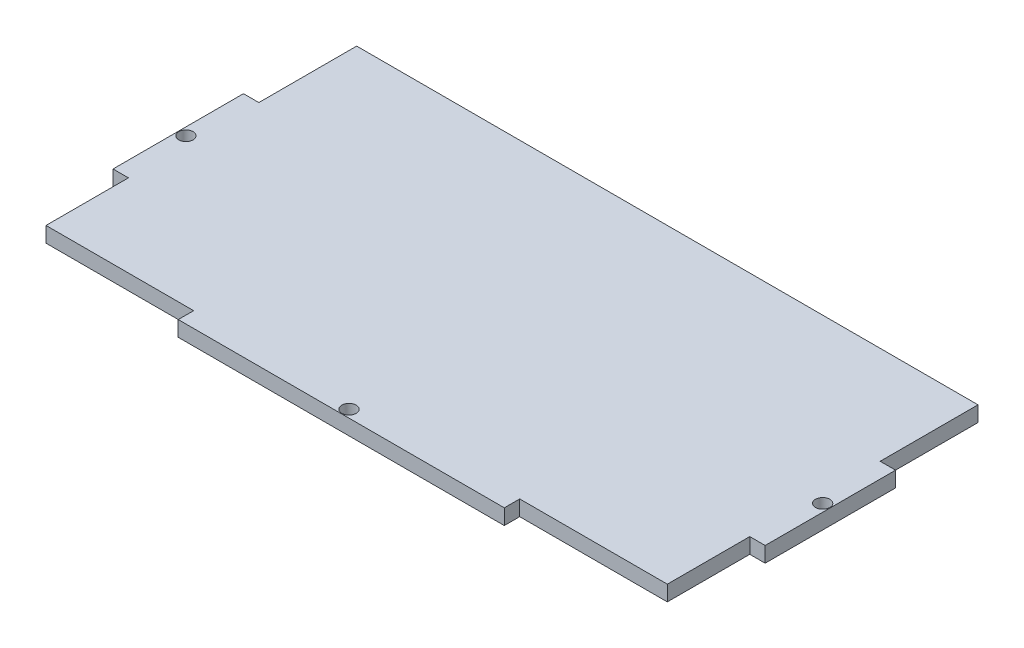
ISO-10303-21;
HEADER;
FILE_DESCRIPTION(('STEP AP214'),'2;1');
FILE_NAME('part.step','',(''),(''),'','','');
FILE_SCHEMA(('AUTOMOTIVE_DESIGN { 1 0 10303 214 1 1 1 1 }'));
ENDSEC;
DATA;
#1=APPLICATION_CONTEXT('core data for automotive mechanical design processes');
#2=APPLICATION_PROTOCOL_DEFINITION('international standard','automotive_design',2000,#1);
#3=PRODUCT_CONTEXT('',#1,'mechanical');
#4=PRODUCT('Part','Part','',(#3));
#5=PRODUCT_RELATED_PRODUCT_CATEGORY('part','',(#4));
#6=PRODUCT_DEFINITION_FORMATION('','',#4);
#7=PRODUCT_DEFINITION_CONTEXT('part definition',#1,'design');
#8=PRODUCT_DEFINITION('design','',#6,#7);
#9=PRODUCT_DEFINITION_SHAPE('','',#8);
#10=(LENGTH_UNIT() NAMED_UNIT(*) SI_UNIT(.MILLI.,.METRE.));
#11=(NAMED_UNIT(*) PLANE_ANGLE_UNIT() SI_UNIT($,.RADIAN.));
#12=(NAMED_UNIT(*) SI_UNIT($,.STERADIAN.) SOLID_ANGLE_UNIT());
#13=UNCERTAINTY_MEASURE_WITH_UNIT(LENGTH_MEASURE(1.E-05),#10,'distance_accuracy_value','');
#14=(GEOMETRIC_REPRESENTATION_CONTEXT(3) GLOBAL_UNCERTAINTY_ASSIGNED_CONTEXT((#13)) GLOBAL_UNIT_ASSIGNED_CONTEXT((#10,
#11,#12)) REPRESENTATION_CONTEXT('',''));
#15=CARTESIAN_POINT('',(0.,0.,0.));
#16=DIRECTION('',(0.,0.,1.));
#17=DIRECTION('',(1.,0.,0.));
#18=AXIS2_PLACEMENT_3D('',#15,#16,#17);
#19=CARTESIAN_POINT('',(63.5,2.9972,31.75));
#20=DIRECTION('',(-1.,0.,0.));
#21=DIRECTION('',(0.,0.,1.));
#22=AXIS2_PLACEMENT_3D('',#19,#20,#21);
#23=PLANE('',#22);
#24=DIRECTION('',(0.,0.,-1.));
#25=VECTOR('',#24,1.);
#26=CARTESIAN_POINT('',(63.5,2.9972,31.75));
#27=LINE('',#26,#25);
#28=CARTESIAN_POINT('',(63.5,2.9972,12.7));
#29=VERTEX_POINT('',#28);
#30=CARTESIAN_POINT('',(63.5,2.9972,-12.7));
#31=VERTEX_POINT('',#30);
#32=EDGE_CURVE('E184',#29,#31,#27,.T.);
#33=ORIENTED_EDGE('',*,*,#32,.F.);
#34=DIRECTION('',(0.,1.,0.));
#35=VECTOR('',#34,1.);
#36=CARTESIAN_POINT('',(63.5,-0.00100000000000013,12.7));
#37=LINE('',#36,#35);
#38=CARTESIAN_POINT('',(63.5,0.,12.7));
#39=VERTEX_POINT('',#38);
#40=EDGE_CURVE('E286',#39,#29,#37,.T.);
#41=ORIENTED_EDGE('',*,*,#40,.F.);
#42=DIRECTION('',(0.,0.,-1.));
#43=VECTOR('',#42,1.);
#44=CARTESIAN_POINT('',(63.5,0.,31.75));
#45=LINE('',#44,#43);
#46=CARTESIAN_POINT('',(63.5,0.,-12.7));
#47=VERTEX_POINT('',#46);
#48=EDGE_CURVE('E186',#39,#47,#45,.T.);
#49=ORIENTED_EDGE('',*,*,#48,.T.);
#50=DIRECTION('',(0.,1.,0.));
#51=VECTOR('',#50,1.);
#52=CARTESIAN_POINT('',(63.5,-0.00100000000000013,-12.7));
#53=LINE('',#52,#51);
#54=EDGE_CURVE('E250',#47,#31,#53,.T.);
#55=ORIENTED_EDGE('',*,*,#54,.T.);
#56=EDGE_LOOP('',(#33,#41,#49,#55));
#57=FACE_BOUND('',#56,.T.);
#58=ADVANCED_FACE('F39',(#57),#23,.F.);
#59=CARTESIAN_POINT('',(-63.5,2.9972,-31.75));
#60=DIRECTION('',(0.,0.,1.));
#61=DIRECTION('',(1.,0.,0.));
#62=AXIS2_PLACEMENT_3D('',#59,#60,#61);
#63=PLANE('',#62);
#64=DIRECTION('',(-1.,0.,0.));
#65=VECTOR('',#64,1.);
#66=CARTESIAN_POINT('',(-63.5,0.,-31.75));
#67=LINE('',#66,#65);
#68=CARTESIAN_POINT('',(60.5028,0.,-31.75));
#69=VERTEX_POINT('',#68);
#70=CARTESIAN_POINT('',(-60.5028,0.,-31.75));
#71=VERTEX_POINT('',#70);
#72=EDGE_CURVE('E180',#69,#71,#67,.T.);
#73=ORIENTED_EDGE('',*,*,#72,.T.);
#74=DIRECTION('',(0.,1.,0.));
#75=VECTOR('',#74,1.);
#76=CARTESIAN_POINT('',(-60.5028,-0.00100000000000013,-31.75));
#77=LINE('',#76,#75);
#78=CARTESIAN_POINT('',(-60.5028,2.9972,-31.75));
#79=VERTEX_POINT('',#78);
#80=EDGE_CURVE('E162',#71,#79,#77,.T.);
#81=ORIENTED_EDGE('',*,*,#80,.T.);
#82=DIRECTION('',(-1.,0.,0.));
#83=VECTOR('',#82,1.);
#84=CARTESIAN_POINT('',(-63.5,2.9972,-31.75));
#85=LINE('',#84,#83);
#86=CARTESIAN_POINT('',(60.5028,2.9972,-31.75));
#87=VERTEX_POINT('',#86);
#88=EDGE_CURVE('E195',#87,#79,#85,.T.);
#89=ORIENTED_EDGE('',*,*,#88,.F.);
#90=DIRECTION('',(0.,1.,0.));
#91=VECTOR('',#90,1.);
#92=CARTESIAN_POINT('',(60.5028,-0.00100000000000013,-31.75));
#93=LINE('',#92,#91);
#94=EDGE_CURVE('E243',#69,#87,#93,.T.);
#95=ORIENTED_EDGE('',*,*,#94,.F.);
#96=EDGE_LOOP('',(#73,#81,#89,#95));
#97=FACE_BOUND('',#96,.T.);
#98=ADVANCED_FACE('F367',(#97),#63,.F.);
#99=CARTESIAN_POINT('',(-63.5,2.9972,31.75));
#100=DIRECTION('',(1.,0.,0.));
#101=DIRECTION('',(0.,0.,-1.));
#102=AXIS2_PLACEMENT_3D('',#99,#100,#101);
#103=PLANE('',#102);
#104=DIRECTION('',(0.,0.,1.));
#105=VECTOR('',#104,1.);
#106=CARTESIAN_POINT('',(-63.5,2.9972,31.75));
#107=LINE('',#106,#105);
#108=CARTESIAN_POINT('',(-63.5,2.9972,-12.7));
#109=VERTEX_POINT('',#108);
#110=CARTESIAN_POINT('',(-63.5,2.9972,12.7));
#111=VERTEX_POINT('',#110);
#112=EDGE_CURVE('E48',#109,#111,#107,.T.);
#113=ORIENTED_EDGE('',*,*,#112,.F.);
#114=DIRECTION('',(0.,1.,0.));
#115=VECTOR('',#114,1.);
#116=CARTESIAN_POINT('',(-63.5,-0.00100000000000013,-12.7));
#117=LINE('',#116,#115);
#118=CARTESIAN_POINT('',(-63.5,0.,-12.7));
#119=VERTEX_POINT('',#118);
#120=EDGE_CURVE('E155',#119,#109,#117,.T.);
#121=ORIENTED_EDGE('',*,*,#120,.F.);
#122=DIRECTION('',(0.,0.,1.));
#123=VECTOR('',#122,1.);
#124=CARTESIAN_POINT('',(-63.5,0.,31.75));
#125=LINE('',#124,#123);
#126=CARTESIAN_POINT('',(-63.5,0.,12.7));
#127=VERTEX_POINT('',#126);
#128=EDGE_CURVE('E169',#119,#127,#125,.T.);
#129=ORIENTED_EDGE('',*,*,#128,.T.);
#130=DIRECTION('',(0.,1.,0.));
#131=VECTOR('',#130,1.);
#132=CARTESIAN_POINT('',(-63.5,-0.00100000000000013,12.7));
#133=LINE('',#132,#131);
#134=EDGE_CURVE('E191',#127,#111,#133,.T.);
#135=ORIENTED_EDGE('',*,*,#134,.T.);
#136=EDGE_LOOP('',(#113,#121,#129,#135));
#137=FACE_BOUND('',#136,.T.);
#138=ADVANCED_FACE('F167',(#137),#103,.F.);
#139=CARTESIAN_POINT('',(-63.5,2.9972,31.75));
#140=DIRECTION('',(0.,0.,-1.));
#141=DIRECTION('',(-1.,0.,0.));
#142=AXIS2_PLACEMENT_3D('',#139,#140,#141);
#143=PLANE('',#142);
#144=DIRECTION('',(1.,0.,0.));
#145=VECTOR('',#144,1.);
#146=CARTESIAN_POINT('',(-63.5,0.,31.75));
#147=LINE('',#146,#145);
#148=CARTESIAN_POINT('',(-31.75,0.,31.75));
#149=VERTEX_POINT('',#148);
#150=CARTESIAN_POINT('',(31.75,0.,31.75));
#151=VERTEX_POINT('',#150);
#152=EDGE_CURVE('E42',#149,#151,#147,.T.);
#153=ORIENTED_EDGE('',*,*,#152,.T.);
#154=DIRECTION('',(0.,1.,0.));
#155=VECTOR('',#154,1.);
#156=CARTESIAN_POINT('',(31.75,-0.00100000000000013,31.75));
#157=LINE('',#156,#155);
#158=CARTESIAN_POINT('',(31.75,2.9972,31.75));
#159=VERTEX_POINT('',#158);
#160=EDGE_CURVE('E282',#151,#159,#157,.T.);
#161=ORIENTED_EDGE('',*,*,#160,.T.);
#162=DIRECTION('',(1.,0.,0.));
#163=VECTOR('',#162,1.);
#164=CARTESIAN_POINT('',(-63.5,2.9972,31.75));
#165=LINE('',#164,#163);
#166=CARTESIAN_POINT('',(-31.75,2.9972,31.75));
#167=VERTEX_POINT('',#166);
#168=EDGE_CURVE('E11',#167,#159,#165,.T.);
#169=ORIENTED_EDGE('',*,*,#168,.F.);
#170=DIRECTION('',(0.,1.,0.));
#171=VECTOR('',#170,1.);
#172=CARTESIAN_POINT('',(-31.75,-0.00100000000000013,31.75));
#173=LINE('',#172,#171);
#174=EDGE_CURVE('E202',#149,#167,#173,.T.);
#175=ORIENTED_EDGE('',*,*,#174,.F.);
#176=EDGE_LOOP('',(#153,#161,#169,#175));
#177=FACE_BOUND('',#176,.T.);
#178=ADVANCED_FACE('F356',(#177),#143,.F.);
#179=CARTESIAN_POINT('',(0.,2.9972,0.));
#180=DIRECTION('',(0.,-1.,0.));
#181=DIRECTION('',(0.,0.,-1.));
#182=AXIS2_PLACEMENT_3D('',#179,#180,#181);
#183=PLANE('',#182);
#184=CARTESIAN_POINT('',(-62.0014,2.9972,0.));
#185=DIRECTION('',(0.,1.,0.));
#186=DIRECTION('',(0.,0.,1.));
#187=AXIS2_PLACEMENT_3D('',#184,#185,#186);
#188=CIRCLE('',#187,1.39700000000001);
#189=CARTESIAN_POINT('',(-62.0014,2.9972,1.39700000000001));
#190=VERTEX_POINT('',#189);
#191=EDGE_CURVE('E318',#190,#190,#188,.T.);
#192=ORIENTED_EDGE('',*,*,#191,.F.);
#193=EDGE_LOOP('',(#192));
#194=FACE_BOUND('',#193,.T.);
#195=CARTESIAN_POINT('',(62.0014,2.9972,0.));
#196=DIRECTION('',(0.,1.,0.));
#197=DIRECTION('',(0.,0.,-1.));
#198=AXIS2_PLACEMENT_3D('',#195,#196,#197);
#199=CIRCLE('',#198,1.39700000000001);
#200=CARTESIAN_POINT('',(62.0014,2.9972,-1.39700000000001));
#201=VERTEX_POINT('',#200);
#202=EDGE_CURVE('E269',#201,#201,#199,.T.);
#203=ORIENTED_EDGE('',*,*,#202,.F.);
#204=EDGE_LOOP('',(#203));
#205=FACE_BOUND('',#204,.T.);
#206=CARTESIAN_POINT('',(0.,2.9972,30.2514));
#207=DIRECTION('',(0.,1.,0.));
#208=DIRECTION('',(0.,0.,-1.));
#209=AXIS2_PLACEMENT_3D('',#206,#207,#208);
#210=CIRCLE('',#209,1.397);
#211=CARTESIAN_POINT('',(0.,2.9972,28.8544));
#212=VERTEX_POINT('',#211);
#213=EDGE_CURVE('E339',#212,#212,#210,.T.);
#214=ORIENTED_EDGE('',*,*,#213,.F.);
#215=EDGE_LOOP('',(#214));
#216=FACE_BOUND('',#215,.T.);
#217=ORIENTED_EDGE('',*,*,#88,.T.);
#218=DIRECTION('',(0.,0.,-1.));
#219=VECTOR('',#218,1.);
#220=CARTESIAN_POINT('',(-60.5028,2.9972,-31.75));
#221=LINE('',#220,#219);
#222=CARTESIAN_POINT('',(-60.5028,2.9972,-12.7));
#223=VERTEX_POINT('',#222);
#224=EDGE_CURVE('E172',#223,#79,#221,.T.);
#225=ORIENTED_EDGE('',*,*,#224,.F.);
#226=DIRECTION('',(1.,0.,0.));
#227=VECTOR('',#226,1.);
#228=CARTESIAN_POINT('',(-63.5,2.9972,-12.7));
#229=LINE('',#228,#227);
#230=EDGE_CURVE('E330',#109,#223,#229,.T.);
#231=ORIENTED_EDGE('',*,*,#230,.F.);
#232=ORIENTED_EDGE('',*,*,#112,.T.);
#233=DIRECTION('',(-1.,0.,0.));
#234=VECTOR('',#233,1.);
#235=CARTESIAN_POINT('',(-63.5,2.9972,12.7));
#236=LINE('',#235,#234);
#237=CARTESIAN_POINT('',(-60.5028,2.9972,12.7));
#238=VERTEX_POINT('',#237);
#239=EDGE_CURVE('E206',#238,#111,#236,.T.);
#240=ORIENTED_EDGE('',*,*,#239,.F.);
#241=DIRECTION('',(0.,0.,-1.));
#242=VECTOR('',#241,1.);
#243=CARTESIAN_POINT('',(-60.5028,2.9972,28.7528));
#244=LINE('',#243,#242);
#245=CARTESIAN_POINT('',(-60.5028,2.9972,28.7528));
#246=VERTEX_POINT('',#245);
#247=EDGE_CURVE('E219',#246,#238,#244,.T.);
#248=ORIENTED_EDGE('',*,*,#247,.F.);
#249=DIRECTION('',(-1.,0.,0.));
#250=VECTOR('',#249,1.);
#251=CARTESIAN_POINT('',(-60.5028,2.9972,28.7528));
#252=LINE('',#251,#250);
#253=CARTESIAN_POINT('',(-31.75,2.9972,28.7528));
#254=VERTEX_POINT('',#253);
#255=EDGE_CURVE('E223',#254,#246,#252,.T.);
#256=ORIENTED_EDGE('',*,*,#255,.F.);
#257=DIRECTION('',(0.,0.,-1.));
#258=VECTOR('',#257,1.);
#259=CARTESIAN_POINT('',(-31.75,2.9972,31.75));
#260=LINE('',#259,#258);
#261=EDGE_CURVE('E227',#167,#254,#260,.T.);
#262=ORIENTED_EDGE('',*,*,#261,.F.);
#263=ORIENTED_EDGE('',*,*,#168,.T.);
#264=DIRECTION('',(0.,0.,1.));
#265=VECTOR('',#264,1.);
#266=CARTESIAN_POINT('',(31.75,2.9972,31.75));
#267=LINE('',#266,#265);
#268=CARTESIAN_POINT('',(31.75,2.9972,28.7528));
#269=VERTEX_POINT('',#268);
#270=EDGE_CURVE('E294',#269,#159,#267,.T.);
#271=ORIENTED_EDGE('',*,*,#270,.F.);
#272=DIRECTION('',(-1.,0.,0.));
#273=VECTOR('',#272,1.);
#274=CARTESIAN_POINT('',(60.5028,2.9972,28.7528));
#275=LINE('',#274,#273);
#276=CARTESIAN_POINT('',(60.5028,2.9972,28.7528));
#277=VERTEX_POINT('',#276);
#278=EDGE_CURVE('E297',#277,#269,#275,.T.);
#279=ORIENTED_EDGE('',*,*,#278,.F.);
#280=DIRECTION('',(0.,0.,1.));
#281=VECTOR('',#280,1.);
#282=CARTESIAN_POINT('',(60.5028,2.9972,28.7528));
#283=LINE('',#282,#281);
#284=CARTESIAN_POINT('',(60.5028,2.9972,12.7));
#285=VERTEX_POINT('',#284);
#286=EDGE_CURVE('E300',#285,#277,#283,.T.);
#287=ORIENTED_EDGE('',*,*,#286,.F.);
#288=DIRECTION('',(-1.,0.,0.));
#289=VECTOR('',#288,1.);
#290=CARTESIAN_POINT('',(63.5,2.9972,12.7));
#291=LINE('',#290,#289);
#292=EDGE_CURVE('E279',#29,#285,#291,.T.);
#293=ORIENTED_EDGE('',*,*,#292,.F.);
#294=ORIENTED_EDGE('',*,*,#32,.T.);
#295=DIRECTION('',(1.,0.,0.));
#296=VECTOR('',#295,1.);
#297=CARTESIAN_POINT('',(63.5,2.9972,-12.7));
#298=LINE('',#297,#296);
#299=CARTESIAN_POINT('',(60.5028,2.9972,-12.7));
#300=VERTEX_POINT('',#299);
#301=EDGE_CURVE('E247',#300,#31,#298,.T.);
#302=ORIENTED_EDGE('',*,*,#301,.F.);
#303=DIRECTION('',(0.,0.,1.));
#304=VECTOR('',#303,1.);
#305=CARTESIAN_POINT('',(60.5028,2.9972,-31.75));
#306=LINE('',#305,#304);
#307=EDGE_CURVE('E257',#87,#300,#306,.T.);
#308=ORIENTED_EDGE('',*,*,#307,.F.);
#309=EDGE_LOOP('',(#217,#225,#231,#232,#240,#248,#256,#262,#263,#271,#279,#287,#293,#294,#302,#308));
#310=FACE_BOUND('',#309,.T.);
#311=ADVANCED_FACE('F353',(#194,#205,#216,#310),#183,.F.);
#312=CARTESIAN_POINT('',(0.,0.,0.));
#313=DIRECTION('',(0.,-1.,0.));
#314=DIRECTION('',(0.,0.,-1.));
#315=AXIS2_PLACEMENT_3D('',#312,#313,#314);
#316=PLANE('',#315);
#317=DIRECTION('',(0.,0.,-1.));
#318=VECTOR('',#317,1.);
#319=CARTESIAN_POINT('',(-60.5028,0.,-31.75));
#320=LINE('',#319,#318);
#321=CARTESIAN_POINT('',(-60.5028,0.,-12.7));
#322=VERTEX_POINT('',#321);
#323=EDGE_CURVE('E321',#322,#71,#320,.T.);
#324=ORIENTED_EDGE('',*,*,#323,.T.);
#325=ORIENTED_EDGE('',*,*,#72,.F.);
#326=DIRECTION('',(0.,0.,1.));
#327=VECTOR('',#326,1.);
#328=CARTESIAN_POINT('',(60.5028,0.,-31.75));
#329=LINE('',#328,#327);
#330=CARTESIAN_POINT('',(60.5028,0.,-12.7));
#331=VERTEX_POINT('',#330);
#332=EDGE_CURVE('E265',#69,#331,#329,.T.);
#333=ORIENTED_EDGE('',*,*,#332,.T.);
#334=DIRECTION('',(1.,0.,0.));
#335=VECTOR('',#334,1.);
#336=CARTESIAN_POINT('',(63.5,0.,-12.7));
#337=LINE('',#336,#335);
#338=EDGE_CURVE('E261',#331,#47,#337,.T.);
#339=ORIENTED_EDGE('',*,*,#338,.T.);
#340=ORIENTED_EDGE('',*,*,#48,.F.);
#341=DIRECTION('',(-1.,0.,0.));
#342=VECTOR('',#341,1.);
#343=CARTESIAN_POINT('',(63.5,0.,12.7));
#344=LINE('',#343,#342);
#345=CARTESIAN_POINT('',(60.5028,0.,12.7));
#346=VERTEX_POINT('',#345);
#347=EDGE_CURVE('E304',#39,#346,#344,.T.);
#348=ORIENTED_EDGE('',*,*,#347,.T.);
#349=DIRECTION('',(0.,0.,1.));
#350=VECTOR('',#349,1.);
#351=CARTESIAN_POINT('',(60.5028,0.,28.7528));
#352=LINE('',#351,#350);
#353=CARTESIAN_POINT('',(60.5028,0.,28.7528));
#354=VERTEX_POINT('',#353);
#355=EDGE_CURVE('E308',#346,#354,#352,.T.);
#356=ORIENTED_EDGE('',*,*,#355,.T.);
#357=DIRECTION('',(-1.,0.,0.));
#358=VECTOR('',#357,1.);
#359=CARTESIAN_POINT('',(60.5028,0.,28.7528));
#360=LINE('',#359,#358);
#361=CARTESIAN_POINT('',(31.75,0.,28.7528));
#362=VERTEX_POINT('',#361);
#363=EDGE_CURVE('E270',#354,#362,#360,.T.);
#364=ORIENTED_EDGE('',*,*,#363,.T.);
#365=DIRECTION('',(0.,0.,1.));
#366=VECTOR('',#365,1.);
#367=CARTESIAN_POINT('',(31.75,0.,31.75));
#368=LINE('',#367,#366);
#369=EDGE_CURVE('E254',#362,#151,#368,.T.);
#370=ORIENTED_EDGE('',*,*,#369,.T.);
#371=ORIENTED_EDGE('',*,*,#152,.F.);
#372=DIRECTION('',(0.,0.,-1.));
#373=VECTOR('',#372,1.);
#374=CARTESIAN_POINT('',(-31.75,0.,31.75));
#375=LINE('',#374,#373);
#376=CARTESIAN_POINT('',(-31.75,0.,28.7528));
#377=VERTEX_POINT('',#376);
#378=EDGE_CURVE('E161',#149,#377,#375,.T.);
#379=ORIENTED_EDGE('',*,*,#378,.T.);
#380=DIRECTION('',(-1.,0.,0.));
#381=VECTOR('',#380,1.);
#382=CARTESIAN_POINT('',(-60.5028,0.,28.7528));
#383=LINE('',#382,#381);
#384=CARTESIAN_POINT('',(-60.5028,0.,28.7528));
#385=VERTEX_POINT('',#384);
#386=EDGE_CURVE('E236',#377,#385,#383,.T.);
#387=ORIENTED_EDGE('',*,*,#386,.T.);
#388=DIRECTION('',(0.,0.,-1.));
#389=VECTOR('',#388,1.);
#390=CARTESIAN_POINT('',(-60.5028,0.,28.7528));
#391=LINE('',#390,#389);
#392=CARTESIAN_POINT('',(-60.5028,0.,12.7));
#393=VERTEX_POINT('',#392);
#394=EDGE_CURVE('E233',#385,#393,#391,.T.);
#395=ORIENTED_EDGE('',*,*,#394,.T.);
#396=DIRECTION('',(-1.,0.,0.));
#397=VECTOR('',#396,1.);
#398=CARTESIAN_POINT('',(-63.5,0.,12.7));
#399=LINE('',#398,#397);
#400=EDGE_CURVE('E178',#393,#127,#399,.T.);
#401=ORIENTED_EDGE('',*,*,#400,.T.);
#402=ORIENTED_EDGE('',*,*,#128,.F.);
#403=DIRECTION('',(1.,0.,0.));
#404=VECTOR('',#403,1.);
#405=CARTESIAN_POINT('',(-63.5,0.,-12.7));
#406=LINE('',#405,#404);
#407=EDGE_CURVE('E152',#119,#322,#406,.T.);
#408=ORIENTED_EDGE('',*,*,#407,.T.);
#409=EDGE_LOOP('',(#324,#325,#333,#339,#340,#348,#356,#364,#370,#371,#379,#387,#395,#401,#402,#408));
#410=FACE_BOUND('',#409,.T.);
#411=CARTESIAN_POINT('',(-62.0014,0.,0.));
#412=DIRECTION('',(0.,-1.,0.));
#413=DIRECTION('',(0.,0.,-1.));
#414=AXIS2_PLACEMENT_3D('',#411,#412,#413);
#415=CIRCLE('',#414,1.39700000000001);
#416=CARTESIAN_POINT('',(-62.0014,0.,-1.39700000000001));
#417=VERTEX_POINT('',#416);
#418=EDGE_CURVE('E274',#417,#417,#415,.F.);
#419=ORIENTED_EDGE('',*,*,#418,.T.);
#420=EDGE_LOOP('',(#419));
#421=FACE_BOUND('',#420,.T.);
#422=CARTESIAN_POINT('',(62.0014,0.,0.));
#423=DIRECTION('',(0.,-1.,0.));
#424=DIRECTION('',(0.,0.,-1.));
#425=AXIS2_PLACEMENT_3D('',#422,#423,#424);
#426=CIRCLE('',#425,1.39700000000001);
#427=CARTESIAN_POINT('',(62.0014,0.,-1.39700000000001));
#428=VERTEX_POINT('',#427);
#429=EDGE_CURVE('E343',#428,#428,#426,.F.);
#430=ORIENTED_EDGE('',*,*,#429,.T.);
#431=EDGE_LOOP('',(#430));
#432=FACE_BOUND('',#431,.T.);
#433=CARTESIAN_POINT('',(0.,0.,30.2514));
#434=DIRECTION('',(0.,-1.,0.));
#435=DIRECTION('',(0.,0.,-1.));
#436=AXIS2_PLACEMENT_3D('',#433,#434,#435);
#437=CIRCLE('',#436,1.397);
#438=CARTESIAN_POINT('',(0.,0.,28.8544));
#439=VERTEX_POINT('',#438);
#440=EDGE_CURVE('E335',#439,#439,#437,.F.);
#441=ORIENTED_EDGE('',*,*,#440,.T.);
#442=EDGE_LOOP('',(#441));
#443=FACE_BOUND('',#442,.T.);
#444=ADVANCED_FACE('F175',(#410,#421,#432,#443),#316,.T.);
#445=CARTESIAN_POINT('',(-63.5,-0.00100000000000013,12.7));
#446=DIRECTION('',(0.,0.,-1.));
#447=DIRECTION('',(-1.,0.,0.));
#448=AXIS2_PLACEMENT_3D('',#445,#446,#447);
#449=PLANE('',#448);
#450=DIRECTION('',(0.,1.,0.));
#451=VECTOR('',#450,1.);
#452=CARTESIAN_POINT('',(-60.5028,-0.00100000000000013,12.7));
#453=LINE('',#452,#451);
#454=EDGE_CURVE('E212',#393,#238,#453,.T.);
#455=ORIENTED_EDGE('',*,*,#454,.T.);
#456=ORIENTED_EDGE('',*,*,#239,.T.);
#457=ORIENTED_EDGE('',*,*,#134,.F.);
#458=ORIENTED_EDGE('',*,*,#400,.F.);
#459=EDGE_LOOP('',(#455,#456,#457,#458));
#460=FACE_BOUND('',#459,.T.);
#461=ADVANCED_FACE('F411',(#460),#449,.F.);
#462=CARTESIAN_POINT('',(-60.5028,-0.00100000000000013,28.7528));
#463=DIRECTION('',(1.,0.,0.));
#464=DIRECTION('',(0.,0.,-1.));
#465=AXIS2_PLACEMENT_3D('',#462,#463,#464);
#466=PLANE('',#465);
#467=DIRECTION('',(0.,1.,0.));
#468=VECTOR('',#467,1.);
#469=CARTESIAN_POINT('',(-60.5028,-0.00100000000000013,28.7528));
#470=LINE('',#469,#468);
#471=EDGE_CURVE('E209',#385,#246,#470,.T.);
#472=ORIENTED_EDGE('',*,*,#471,.T.);
#473=ORIENTED_EDGE('',*,*,#247,.T.);
#474=ORIENTED_EDGE('',*,*,#454,.F.);
#475=ORIENTED_EDGE('',*,*,#394,.F.);
#476=EDGE_LOOP('',(#472,#473,#474,#475));
#477=FACE_BOUND('',#476,.T.);
#478=ADVANCED_FACE('F407',(#477),#466,.F.);
#479=CARTESIAN_POINT('',(-60.5028,-0.00100000000000013,28.7528));
#480=DIRECTION('',(0.,0.,-1.));
#481=DIRECTION('',(-1.,0.,0.));
#482=AXIS2_PLACEMENT_3D('',#479,#480,#481);
#483=PLANE('',#482);
#484=DIRECTION('',(0.,1.,0.));
#485=VECTOR('',#484,1.);
#486=CARTESIAN_POINT('',(-31.75,-0.00100000000000013,28.7528));
#487=LINE('',#486,#485);
#488=EDGE_CURVE('E205',#377,#254,#487,.T.);
#489=ORIENTED_EDGE('',*,*,#488,.T.);
#490=ORIENTED_EDGE('',*,*,#255,.T.);
#491=ORIENTED_EDGE('',*,*,#471,.F.);
#492=ORIENTED_EDGE('',*,*,#386,.F.);
#493=EDGE_LOOP('',(#489,#490,#491,#492));
#494=FACE_BOUND('',#493,.T.);
#495=ADVANCED_FACE('F404',(#494),#483,.F.);
#496=CARTESIAN_POINT('',(-31.75,-0.00100000000000013,31.75));
#497=DIRECTION('',(1.,0.,0.));
#498=DIRECTION('',(0.,0.,-1.));
#499=AXIS2_PLACEMENT_3D('',#496,#497,#498);
#500=PLANE('',#499);
#501=ORIENTED_EDGE('',*,*,#174,.T.);
#502=ORIENTED_EDGE('',*,*,#261,.T.);
#503=ORIENTED_EDGE('',*,*,#488,.F.);
#504=ORIENTED_EDGE('',*,*,#378,.F.);
#505=EDGE_LOOP('',(#501,#502,#503,#504));
#506=FACE_BOUND('',#505,.T.);
#507=ADVANCED_FACE('F400',(#506),#500,.F.);
#508=CARTESIAN_POINT('',(0.,-0.00100000000000013,30.2514));
#509=DIRECTION('',(0.,1.,0.));
#510=DIRECTION('',(0.,0.,1.));
#511=AXIS2_PLACEMENT_3D('',#508,#509,#510);
#512=CYLINDRICAL_SURFACE('',#511,1.397);
#513=ORIENTED_EDGE('',*,*,#440,.F.);
#514=EDGE_LOOP('',(#513));
#515=FACE_BOUND('',#514,.T.);
#516=ORIENTED_EDGE('',*,*,#213,.T.);
#517=EDGE_LOOP('',(#516));
#518=FACE_BOUND('',#517,.T.);
#519=ADVANCED_FACE('F434',(#515,#518),#512,.F.);
#520=CARTESIAN_POINT('',(62.0014,-0.00100000000000013,0.));
#521=DIRECTION('',(0.,1.,0.));
#522=DIRECTION('',(0.,0.,1.));
#523=AXIS2_PLACEMENT_3D('',#520,#521,#522);
#524=CYLINDRICAL_SURFACE('',#523,1.39700000000001);
#525=ORIENTED_EDGE('',*,*,#429,.F.);
#526=EDGE_LOOP('',(#525));
#527=FACE_BOUND('',#526,.T.);
#528=ORIENTED_EDGE('',*,*,#202,.T.);
#529=EDGE_LOOP('',(#528));
#530=FACE_BOUND('',#529,.T.);
#531=ADVANCED_FACE('F351',(#527,#530),#524,.F.);
#532=CARTESIAN_POINT('',(63.5,-0.00100000000000013,-12.7));
#533=DIRECTION('',(0.,0.,1.));
#534=DIRECTION('',(1.,0.,0.));
#535=AXIS2_PLACEMENT_3D('',#532,#533,#534);
#536=PLANE('',#535);
#537=DIRECTION('',(0.,1.,0.));
#538=VECTOR('',#537,1.);
#539=CARTESIAN_POINT('',(60.5028,-0.00100000000000013,-12.7));
#540=LINE('',#539,#538);
#541=EDGE_CURVE('E246',#331,#300,#540,.T.);
#542=ORIENTED_EDGE('',*,*,#541,.T.);
#543=ORIENTED_EDGE('',*,*,#301,.T.);
#544=ORIENTED_EDGE('',*,*,#54,.F.);
#545=ORIENTED_EDGE('',*,*,#338,.F.);
#546=EDGE_LOOP('',(#542,#543,#544,#545));
#547=FACE_BOUND('',#546,.T.);
#548=ADVANCED_FACE('F376',(#547),#536,.F.);
#549=CARTESIAN_POINT('',(60.5028,-0.00100000000000013,-31.75));
#550=DIRECTION('',(-1.,0.,0.));
#551=DIRECTION('',(0.,0.,1.));
#552=AXIS2_PLACEMENT_3D('',#549,#550,#551);
#553=PLANE('',#552);
#554=ORIENTED_EDGE('',*,*,#94,.T.);
#555=ORIENTED_EDGE('',*,*,#307,.T.);
#556=ORIENTED_EDGE('',*,*,#541,.F.);
#557=ORIENTED_EDGE('',*,*,#332,.F.);
#558=EDGE_LOOP('',(#554,#555,#556,#557));
#559=FACE_BOUND('',#558,.T.);
#560=ADVANCED_FACE('F374',(#559),#553,.F.);
#561=CARTESIAN_POINT('',(60.5028,-0.00100000000000013,28.7528));
#562=DIRECTION('',(-1.,0.,0.));
#563=DIRECTION('',(0.,0.,1.));
#564=AXIS2_PLACEMENT_3D('',#561,#562,#563);
#565=PLANE('',#564);
#566=DIRECTION('',(0.,1.,0.));
#567=VECTOR('',#566,1.);
#568=CARTESIAN_POINT('',(60.5028,-0.00100000000000013,12.7));
#569=LINE('',#568,#567);
#570=EDGE_CURVE('E275',#346,#285,#569,.T.);
#571=ORIENTED_EDGE('',*,*,#570,.T.);
#572=ORIENTED_EDGE('',*,*,#286,.T.);
#573=DIRECTION('',(0.,1.,0.));
#574=VECTOR('',#573,1.);
#575=CARTESIAN_POINT('',(60.5028,-0.00100000000000013,28.7528));
#576=LINE('',#575,#574);
#577=EDGE_CURVE('E276',#354,#277,#576,.T.);
#578=ORIENTED_EDGE('',*,*,#577,.F.);
#579=ORIENTED_EDGE('',*,*,#355,.F.);
#580=EDGE_LOOP('',(#571,#572,#578,#579));
#581=FACE_BOUND('',#580,.T.);
#582=ADVANCED_FACE('F388',(#581),#565,.F.);
#583=CARTESIAN_POINT('',(63.5,-0.00100000000000013,12.7));
#584=DIRECTION('',(0.,0.,-1.));
#585=DIRECTION('',(-1.,0.,0.));
#586=AXIS2_PLACEMENT_3D('',#583,#584,#585);
#587=PLANE('',#586);
#588=ORIENTED_EDGE('',*,*,#40,.T.);
#589=ORIENTED_EDGE('',*,*,#292,.T.);
#590=ORIENTED_EDGE('',*,*,#570,.F.);
#591=ORIENTED_EDGE('',*,*,#347,.F.);
#592=EDGE_LOOP('',(#588,#589,#590,#591));
#593=FACE_BOUND('',#592,.T.);
#594=ADVANCED_FACE('F385',(#593),#587,.F.);
#595=CARTESIAN_POINT('',(31.75,-0.00100000000000013,31.75));
#596=DIRECTION('',(-1.,0.,0.));
#597=DIRECTION('',(0.,0.,1.));
#598=AXIS2_PLACEMENT_3D('',#595,#596,#597);
#599=PLANE('',#598);
#600=DIRECTION('',(0.,1.,0.));
#601=VECTOR('',#600,1.);
#602=CARTESIAN_POINT('',(31.75,-0.00100000000000013,28.7528));
#603=LINE('',#602,#601);
#604=EDGE_CURVE('E64',#362,#269,#603,.T.);
#605=ORIENTED_EDGE('',*,*,#604,.T.);
#606=ORIENTED_EDGE('',*,*,#270,.T.);
#607=ORIENTED_EDGE('',*,*,#160,.F.);
#608=ORIENTED_EDGE('',*,*,#369,.F.);
#609=EDGE_LOOP('',(#605,#606,#607,#608));
#610=FACE_BOUND('',#609,.T.);
#611=ADVANCED_FACE('F394',(#610),#599,.F.);
#612=CARTESIAN_POINT('',(60.5028,-0.00100000000000013,28.7528));
#613=DIRECTION('',(0.,0.,-1.));
#614=DIRECTION('',(-1.,0.,0.));
#615=AXIS2_PLACEMENT_3D('',#612,#613,#614);
#616=PLANE('',#615);
#617=ORIENTED_EDGE('',*,*,#577,.T.);
#618=ORIENTED_EDGE('',*,*,#278,.T.);
#619=ORIENTED_EDGE('',*,*,#604,.F.);
#620=ORIENTED_EDGE('',*,*,#363,.F.);
#621=EDGE_LOOP('',(#617,#618,#619,#620));
#622=FACE_BOUND('',#621,.T.);
#623=ADVANCED_FACE('F389',(#622),#616,.F.);
#624=CARTESIAN_POINT('',(-62.0014,-0.00100000000000013,0.));
#625=DIRECTION('',(0.,1.,0.));
#626=DIRECTION('',(0.,0.,1.));
#627=AXIS2_PLACEMENT_3D('',#624,#625,#626);
#628=CYLINDRICAL_SURFACE('',#627,1.39700000000001);
#629=ORIENTED_EDGE('',*,*,#418,.F.);
#630=EDGE_LOOP('',(#629));
#631=FACE_BOUND('',#630,.T.);
#632=ORIENTED_EDGE('',*,*,#191,.T.);
#633=EDGE_LOOP('',(#632));
#634=FACE_BOUND('',#633,.T.);
#635=ADVANCED_FACE('F493',(#631,#634),#628,.F.);
#636=CARTESIAN_POINT('',(-60.5028,-0.00100000000000013,-31.75));
#637=DIRECTION('',(1.,0.,0.));
#638=DIRECTION('',(0.,0.,-1.));
#639=AXIS2_PLACEMENT_3D('',#636,#637,#638);
#640=PLANE('',#639);
#641=DIRECTION('',(0.,1.,0.));
#642=VECTOR('',#641,1.);
#643=CARTESIAN_POINT('',(-60.5028,-0.00100000000000013,-12.7));
#644=LINE('',#643,#642);
#645=EDGE_CURVE('E56',#322,#223,#644,.T.);
#646=ORIENTED_EDGE('',*,*,#645,.T.);
#647=ORIENTED_EDGE('',*,*,#224,.T.);
#648=ORIENTED_EDGE('',*,*,#80,.F.);
#649=ORIENTED_EDGE('',*,*,#323,.F.);
#650=EDGE_LOOP('',(#646,#647,#648,#649));
#651=FACE_BOUND('',#650,.T.);
#652=ADVANCED_FACE('F370',(#651),#640,.F.);
#653=CARTESIAN_POINT('',(-63.5,-0.00100000000000013,-12.7));
#654=DIRECTION('',(0.,0.,1.));
#655=DIRECTION('',(1.,0.,0.));
#656=AXIS2_PLACEMENT_3D('',#653,#654,#655);
#657=PLANE('',#656);
#658=ORIENTED_EDGE('',*,*,#120,.T.);
#659=ORIENTED_EDGE('',*,*,#230,.T.);
#660=ORIENTED_EDGE('',*,*,#645,.F.);
#661=ORIENTED_EDGE('',*,*,#407,.F.);
#662=EDGE_LOOP('',(#658,#659,#660,#661));
#663=FACE_BOUND('',#662,.T.);
#664=ADVANCED_FACE('F154',(#663),#657,.F.);
#665=CLOSED_SHELL('',(#58,#98,#138,#178,#311,#444,#461,#478,#495,#507,#519,#531,#548,#560,#582,
#594,#611,#623,#635,#652,#664));
#666=MANIFOLD_SOLID_BREP('B2',#665);
#667=ADVANCED_BREP_SHAPE_REPRESENTATION('',(#18,#666),#14);
#668=SHAPE_DEFINITION_REPRESENTATION(#9,#667);
ENDSEC;
END-ISO-10303-21;
